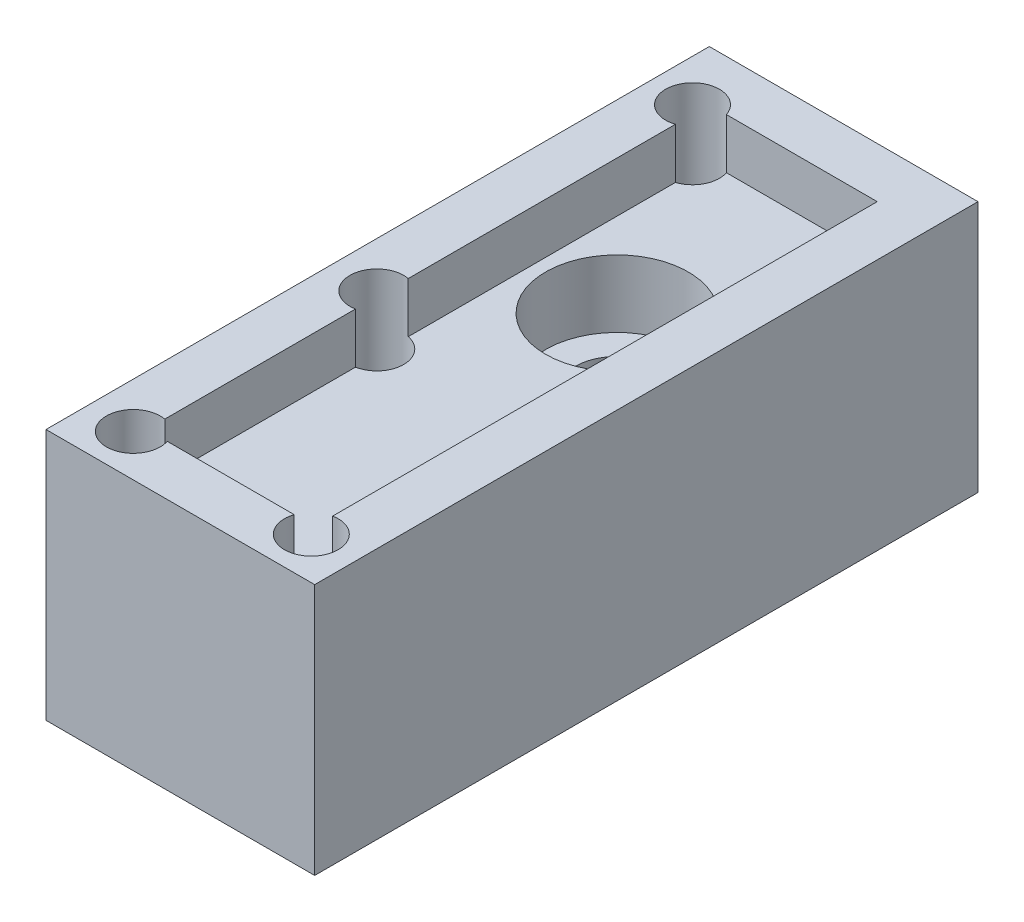
ISO-10303-21;
HEADER;
FILE_DESCRIPTION(('STEP AP214'),'2;1');
FILE_NAME('part.step','',(''),(''),'','','');
FILE_SCHEMA(('AUTOMOTIVE_DESIGN { 1 0 10303 214 1 1 1 1 }'));
ENDSEC;
DATA;
#1=APPLICATION_CONTEXT('core data for automotive mechanical design processes');
#2=APPLICATION_PROTOCOL_DEFINITION('international standard','automotive_design',2000,#1);
#3=PRODUCT_CONTEXT('',#1,'mechanical');
#4=PRODUCT('Part','Part','',(#3));
#5=PRODUCT_RELATED_PRODUCT_CATEGORY('part','',(#4));
#6=PRODUCT_DEFINITION_FORMATION('','',#4);
#7=PRODUCT_DEFINITION_CONTEXT('part definition',#1,'design');
#8=PRODUCT_DEFINITION('design','',#6,#7);
#9=PRODUCT_DEFINITION_SHAPE('','',#8);
#10=(LENGTH_UNIT() NAMED_UNIT(*) SI_UNIT(.MILLI.,.METRE.));
#11=(NAMED_UNIT(*) PLANE_ANGLE_UNIT() SI_UNIT($,.RADIAN.));
#12=(NAMED_UNIT(*) SI_UNIT($,.STERADIAN.) SOLID_ANGLE_UNIT());
#13=UNCERTAINTY_MEASURE_WITH_UNIT(LENGTH_MEASURE(1.E-05),#10,'distance_accuracy_value','');
#14=(GEOMETRIC_REPRESENTATION_CONTEXT(3) GLOBAL_UNCERTAINTY_ASSIGNED_CONTEXT((#13)) GLOBAL_UNIT_ASSIGNED_CONTEXT((#10,
#11,#12)) REPRESENTATION_CONTEXT('',''));
#15=CARTESIAN_POINT('',(0.,0.,0.));
#16=DIRECTION('',(0.,0.,1.));
#17=DIRECTION('',(1.,0.,0.));
#18=AXIS2_PLACEMENT_3D('',#15,#16,#17);
#19=CARTESIAN_POINT('',(8.,-8.,-26.));
#20=DIRECTION('',(0.,1.,0.));
#21=DIRECTION('',(0.,0.,1.));
#22=AXIS2_PLACEMENT_3D('',#19,#20,#21);
#23=CYLINDRICAL_SURFACE('',#22,2.5);
#24=CARTESIAN_POINT('',(8.,0.,-26.));
#25=DIRECTION('',(0.,-1.,0.));
#26=DIRECTION('',(0.,0.,-1.));
#27=AXIS2_PLACEMENT_3D('',#24,#25,#26);
#28=CIRCLE('',#27,2.5);
#29=CARTESIAN_POINT('',(8.,0.,-28.5));
#30=VERTEX_POINT('',#29);
#31=EDGE_CURVE('E242',#30,#30,#28,.T.);
#32=ORIENTED_EDGE('',*,*,#31,.T.);
#33=EDGE_LOOP('',(#32));
#34=FACE_BOUND('',#33,.T.);
#35=CARTESIAN_POINT('',(8.,8.,-26.));
#36=DIRECTION('',(0.,1.,0.));
#37=DIRECTION('',(0.,0.,1.));
#38=AXIS2_PLACEMENT_3D('',#35,#36,#37);
#39=CIRCLE('',#38,2.5);
#40=CARTESIAN_POINT('',(8.,8.,-23.5));
#41=VERTEX_POINT('',#40);
#42=EDGE_CURVE('E36',#41,#41,#39,.F.);
#43=ORIENTED_EDGE('',*,*,#42,.F.);
#44=EDGE_LOOP('',(#43));
#45=FACE_BOUND('',#44,.T.);
#46=ADVANCED_FACE('F32',(#34,#45),#23,.F.);
#47=CARTESIAN_POINT('',(3.,12.,-3.));
#48=DIRECTION('',(-1.,0.,0.));
#49=DIRECTION('',(0.,0.,1.));
#50=AXIS2_PLACEMENT_3D('',#47,#48,#49);
#51=PLANE('',#50);
#52=DIRECTION('',(0.,-1.,0.));
#53=VECTOR('',#52,1.);
#54=CARTESIAN_POINT('',(3.,18.,-18.5716233645502));
#55=LINE('',#54,#53);
#56=CARTESIAN_POINT('',(3.,12.,-18.5716233645502));
#57=VERTEX_POINT('',#56);
#58=CARTESIAN_POINT('',(3.,15.,-18.5716233645502));
#59=VERTEX_POINT('',#58);
#60=EDGE_CURVE('E205',#57,#59,#55,.F.);
#61=ORIENTED_EDGE('',*,*,#60,.F.);
#62=DIRECTION('',(0.,0.,1.));
#63=VECTOR('',#62,1.);
#64=CARTESIAN_POINT('',(3.,12.,-3.));
#65=LINE('',#64,#63);
#66=CARTESIAN_POINT('',(3.,12.,-34.4801315846429));
#67=VERTEX_POINT('',#66);
#68=EDGE_CURVE('E211',#67,#57,#65,.T.);
#69=ORIENTED_EDGE('',*,*,#68,.F.);
#70=DIRECTION('',(0.,-1.,0.));
#71=VECTOR('',#70,1.);
#72=CARTESIAN_POINT('',(3.,18.,-34.4801315846429));
#73=LINE('',#72,#71);
#74=CARTESIAN_POINT('',(3.,15.,-34.4801315846429));
#75=VERTEX_POINT('',#74);
#76=EDGE_CURVE('E132',#75,#67,#73,.T.);
#77=ORIENTED_EDGE('',*,*,#76,.F.);
#78=DIRECTION('',(0.,0.,1.));
#79=VECTOR('',#78,1.);
#80=CARTESIAN_POINT('',(3.,15.,-3.));
#81=LINE('',#80,#79);
#82=EDGE_CURVE('E163',#75,#59,#81,.T.);
#83=ORIENTED_EDGE('',*,*,#82,.T.);
#84=EDGE_LOOP('',(#61,#69,#77,#83));
#85=FACE_BOUND('',#84,.T.);
#86=ADVANCED_FACE('F210',(#85),#51,.F.);
#87=DIRECTION('',(0.,-1.,0.));
#88=VECTOR('',#87,1.);
#89=CARTESIAN_POINT('',(3.,18.,-15.4283766354498));
#90=LINE('',#89,#88);
#91=CARTESIAN_POINT('',(3.,15.,-15.4283766354498));
#92=VERTEX_POINT('',#91);
#93=CARTESIAN_POINT('',(3.,12.,-15.4283766354498));
#94=VERTEX_POINT('',#93);
#95=EDGE_CURVE('E55',#92,#94,#90,.T.);
#96=ORIENTED_EDGE('',*,*,#95,.F.);
#97=CARTESIAN_POINT('',(3.,15.,-4.07162336455017));
#98=VERTEX_POINT('',#97);
#99=EDGE_CURVE('E161',#92,#98,#81,.T.);
#100=ORIENTED_EDGE('',*,*,#99,.T.);
#101=DIRECTION('',(0.,1.,0.));
#102=VECTOR('',#101,1.);
#103=CARTESIAN_POINT('',(3.,0.,-4.07162336455017));
#104=LINE('',#103,#102);
#105=CARTESIAN_POINT('',(3.,12.,-4.07162336455017));
#106=VERTEX_POINT('',#105);
#107=EDGE_CURVE('E164',#98,#106,#104,.F.);
#108=ORIENTED_EDGE('',*,*,#107,.T.);
#109=EDGE_CURVE('E170',#94,#106,#65,.T.);
#110=ORIENTED_EDGE('',*,*,#109,.F.);
#111=EDGE_LOOP('',(#96,#100,#108,#110));
#112=FACE_BOUND('',#111,.T.);
#113=ADVANCED_FACE('F267',(#112),#51,.F.);
#114=CARTESIAN_POINT('',(3.,12.,-36.5));
#115=DIRECTION('',(0.,0.,-1.));
#116=DIRECTION('',(-1.,0.,0.));
#117=AXIS2_PLACEMENT_3D('',#114,#115,#116);
#118=PLANE('',#117);
#119=DIRECTION('',(0.,-1.,0.));
#120=VECTOR('',#119,1.);
#121=CARTESIAN_POINT('',(4.01986841535706,18.,-36.5));
#122=LINE('',#121,#120);
#123=CARTESIAN_POINT('',(4.01986841535706,12.,-36.5));
#124=VERTEX_POINT('',#123);
#125=CARTESIAN_POINT('',(4.01986841535706,15.,-36.5));
#126=VERTEX_POINT('',#125);
#127=EDGE_CURVE('E129',#124,#126,#122,.F.);
#128=ORIENTED_EDGE('',*,*,#127,.F.);
#129=DIRECTION('',(-1.,0.,0.));
#130=VECTOR('',#129,1.);
#131=CARTESIAN_POINT('',(3.,12.,-36.5));
#132=LINE('',#131,#130);
#133=CARTESIAN_POINT('',(13.,12.,-36.5));
#134=VERTEX_POINT('',#133);
#135=EDGE_CURVE('E144',#134,#124,#132,.T.);
#136=ORIENTED_EDGE('',*,*,#135,.F.);
#137=DIRECTION('',(0.,1.,0.));
#138=VECTOR('',#137,1.);
#139=CARTESIAN_POINT('',(13.,12.,-36.5));
#140=LINE('',#139,#138);
#141=CARTESIAN_POINT('',(13.,15.,-36.5));
#142=VERTEX_POINT('',#141);
#143=EDGE_CURVE('E153',#134,#142,#140,.T.);
#144=ORIENTED_EDGE('',*,*,#143,.T.);
#145=DIRECTION('',(-1.,0.,0.));
#146=VECTOR('',#145,1.);
#147=CARTESIAN_POINT('',(3.,15.,-36.5));
#148=LINE('',#147,#146);
#149=EDGE_CURVE('E146',#142,#126,#148,.T.);
#150=ORIENTED_EDGE('',*,*,#149,.T.);
#151=EDGE_LOOP('',(#128,#136,#144,#150));
#152=FACE_BOUND('',#151,.T.);
#153=ADVANCED_FACE('F142',(#152),#118,.F.);
#154=CARTESIAN_POINT('',(13.,12.,-3.));
#155=DIRECTION('',(1.,0.,0.));
#156=DIRECTION('',(0.,0.,-1.));
#157=AXIS2_PLACEMENT_3D('',#154,#155,#156);
#158=PLANE('',#157);
#159=DIRECTION('',(0.,-1.,0.));
#160=VECTOR('',#159,1.);
#161=CARTESIAN_POINT('',(13.,18.,-4.07162336455017));
#162=LINE('',#161,#160);
#163=CARTESIAN_POINT('',(13.,15.,-4.07162336455017));
#164=VERTEX_POINT('',#163);
#165=CARTESIAN_POINT('',(13.,12.,-4.07162336455017));
#166=VERTEX_POINT('',#165);
#167=EDGE_CURVE('E47',#164,#166,#162,.T.);
#168=ORIENTED_EDGE('',*,*,#167,.F.);
#169=DIRECTION('',(0.,0.,-1.));
#170=VECTOR('',#169,1.);
#171=CARTESIAN_POINT('',(13.,15.,-3.));
#172=LINE('',#171,#170);
#173=EDGE_CURVE('E168',#164,#142,#172,.T.);
#174=ORIENTED_EDGE('',*,*,#173,.T.);
#175=ORIENTED_EDGE('',*,*,#143,.F.);
#176=DIRECTION('',(0.,0.,-1.));
#177=VECTOR('',#176,1.);
#178=CARTESIAN_POINT('',(13.,12.,-3.));
#179=LINE('',#178,#177);
#180=EDGE_CURVE('E151',#166,#134,#179,.T.);
#181=ORIENTED_EDGE('',*,*,#180,.F.);
#182=EDGE_LOOP('',(#168,#174,#175,#181));
#183=FACE_BOUND('',#182,.T.);
#184=ADVANCED_FACE('F293',(#183),#158,.F.);
#185=CARTESIAN_POINT('',(3.,12.,-3.));
#186=DIRECTION('',(0.,0.,1.));
#187=DIRECTION('',(1.,0.,0.));
#188=AXIS2_PLACEMENT_3D('',#185,#186,#187);
#189=PLANE('',#188);
#190=DIRECTION('',(0.,-1.,0.));
#191=VECTOR('',#190,1.);
#192=CARTESIAN_POINT('',(11.7801315846429,18.,-3.));
#193=LINE('',#192,#191);
#194=CARTESIAN_POINT('',(11.7801315846429,12.,-3.));
#195=VERTEX_POINT('',#194);
#196=CARTESIAN_POINT('',(11.7801315846429,15.,-3.));
#197=VERTEX_POINT('',#196);
#198=EDGE_CURVE('E231',#195,#197,#193,.F.);
#199=ORIENTED_EDGE('',*,*,#198,.F.);
#200=DIRECTION('',(1.,0.,0.));
#201=VECTOR('',#200,1.);
#202=CARTESIAN_POINT('',(3.,12.,-3.));
#203=LINE('',#202,#201);
#204=CARTESIAN_POINT('',(4.21986841535707,12.,-3.));
#205=VERTEX_POINT('',#204);
#206=EDGE_CURVE('E157',#205,#195,#203,.T.);
#207=ORIENTED_EDGE('',*,*,#206,.F.);
#208=DIRECTION('',(0.,1.,0.));
#209=VECTOR('',#208,1.);
#210=CARTESIAN_POINT('',(4.21986841535707,0.,-3.));
#211=LINE('',#210,#209);
#212=CARTESIAN_POINT('',(4.21986841535707,15.,-3.));
#213=VERTEX_POINT('',#212);
#214=EDGE_CURVE('E220',#205,#213,#211,.T.);
#215=ORIENTED_EDGE('',*,*,#214,.T.);
#216=DIRECTION('',(1.,0.,0.));
#217=VECTOR('',#216,1.);
#218=CARTESIAN_POINT('',(3.,15.,-3.));
#219=LINE('',#218,#217);
#220=EDGE_CURVE('E165',#213,#197,#219,.T.);
#221=ORIENTED_EDGE('',*,*,#220,.T.);
#222=EDGE_LOOP('',(#199,#207,#215,#221));
#223=FACE_BOUND('',#222,.T.);
#224=ADVANCED_FACE('F296',(#223),#189,.F.);
#225=CARTESIAN_POINT('',(0.,15.,0.));
#226=DIRECTION('',(1.,0.,0.));
#227=DIRECTION('',(0.,0.,-1.));
#228=AXIS2_PLACEMENT_3D('',#225,#226,#227);
#229=PLANE('',#228);
#230=DIRECTION('',(0.,0.,1.));
#231=VECTOR('',#230,1.);
#232=CARTESIAN_POINT('',(0.,0.,0.));
#233=LINE('',#232,#231);
#234=CARTESIAN_POINT('',(0.,0.,-39.5));
#235=VERTEX_POINT('',#234);
#236=CARTESIAN_POINT('',(0.,0.,0.));
#237=VERTEX_POINT('',#236);
#238=EDGE_CURVE('E155',#235,#237,#233,.T.);
#239=ORIENTED_EDGE('',*,*,#238,.T.);
#240=DIRECTION('',(0.,-1.,0.));
#241=VECTOR('',#240,1.);
#242=CARTESIAN_POINT('',(0.,15.,0.));
#243=LINE('',#242,#241);
#244=CARTESIAN_POINT('',(0.,15.,0.));
#245=VERTEX_POINT('',#244);
#246=EDGE_CURVE('E198',#245,#237,#243,.T.);
#247=ORIENTED_EDGE('',*,*,#246,.F.);
#248=DIRECTION('',(0.,0.,1.));
#249=VECTOR('',#248,1.);
#250=CARTESIAN_POINT('',(0.,15.,0.));
#251=LINE('',#250,#249);
#252=CARTESIAN_POINT('',(0.,15.,-39.5));
#253=VERTEX_POINT('',#252);
#254=EDGE_CURVE('E172',#253,#245,#251,.T.);
#255=ORIENTED_EDGE('',*,*,#254,.F.);
#256=DIRECTION('',(0.,-1.,0.));
#257=VECTOR('',#256,1.);
#258=CARTESIAN_POINT('',(0.,15.,-39.5));
#259=LINE('',#258,#257);
#260=EDGE_CURVE('E182',#253,#235,#259,.T.);
#261=ORIENTED_EDGE('',*,*,#260,.T.);
#262=EDGE_LOOP('',(#239,#247,#255,#261));
#263=FACE_BOUND('',#262,.T.);
#264=ADVANCED_FACE('F34',(#263),#229,.F.);
#265=CARTESIAN_POINT('',(0.,15.,0.));
#266=DIRECTION('',(0.,0.,-1.));
#267=DIRECTION('',(-1.,0.,0.));
#268=AXIS2_PLACEMENT_3D('',#265,#266,#267);
#269=PLANE('',#268);
#270=DIRECTION('',(1.,0.,0.));
#271=VECTOR('',#270,1.);
#272=CARTESIAN_POINT('',(0.,0.,0.));
#273=LINE('',#272,#271);
#274=CARTESIAN_POINT('',(16.,0.,0.));
#275=VERTEX_POINT('',#274);
#276=EDGE_CURVE('E185',#237,#275,#273,.T.);
#277=ORIENTED_EDGE('',*,*,#276,.T.);
#278=DIRECTION('',(0.,-1.,0.));
#279=VECTOR('',#278,1.);
#280=CARTESIAN_POINT('',(16.,15.,0.));
#281=LINE('',#280,#279);
#282=CARTESIAN_POINT('',(16.,15.,0.));
#283=VERTEX_POINT('',#282);
#284=EDGE_CURVE('E195',#283,#275,#281,.T.);
#285=ORIENTED_EDGE('',*,*,#284,.F.);
#286=DIRECTION('',(1.,0.,0.));
#287=VECTOR('',#286,1.);
#288=CARTESIAN_POINT('',(0.,15.,0.));
#289=LINE('',#288,#287);
#290=EDGE_CURVE('E175',#245,#283,#289,.T.);
#291=ORIENTED_EDGE('',*,*,#290,.F.);
#292=ORIENTED_EDGE('',*,*,#246,.T.);
#293=EDGE_LOOP('',(#277,#285,#291,#292));
#294=FACE_BOUND('',#293,.T.);
#295=ADVANCED_FACE('F314',(#294),#269,.F.);
#296=CARTESIAN_POINT('',(16.,15.,0.));
#297=DIRECTION('',(-1.,0.,0.));
#298=DIRECTION('',(0.,0.,1.));
#299=AXIS2_PLACEMENT_3D('',#296,#297,#298);
#300=PLANE('',#299);
#301=DIRECTION('',(0.,0.,-1.));
#302=VECTOR('',#301,1.);
#303=CARTESIAN_POINT('',(16.,0.,0.));
#304=LINE('',#303,#302);
#305=CARTESIAN_POINT('',(16.,0.,-39.5));
#306=VERTEX_POINT('',#305);
#307=EDGE_CURVE('E187',#275,#306,#304,.T.);
#308=ORIENTED_EDGE('',*,*,#307,.T.);
#309=DIRECTION('',(0.,-1.,0.));
#310=VECTOR('',#309,1.);
#311=CARTESIAN_POINT('',(16.,15.,-39.5));
#312=LINE('',#311,#310);
#313=CARTESIAN_POINT('',(16.,15.,-39.5));
#314=VERTEX_POINT('',#313);
#315=EDGE_CURVE('E192',#314,#306,#312,.T.);
#316=ORIENTED_EDGE('',*,*,#315,.F.);
#317=DIRECTION('',(0.,0.,-1.));
#318=VECTOR('',#317,1.);
#319=CARTESIAN_POINT('',(16.,15.,0.));
#320=LINE('',#319,#318);
#321=EDGE_CURVE('E178',#283,#314,#320,.T.);
#322=ORIENTED_EDGE('',*,*,#321,.F.);
#323=ORIENTED_EDGE('',*,*,#284,.T.);
#324=EDGE_LOOP('',(#308,#316,#322,#323));
#325=FACE_BOUND('',#324,.T.);
#326=ADVANCED_FACE('F311',(#325),#300,.F.);
#327=CARTESIAN_POINT('',(0.,15.,-39.5));
#328=DIRECTION('',(0.,0.,1.));
#329=DIRECTION('',(1.,0.,0.));
#330=AXIS2_PLACEMENT_3D('',#327,#328,#329);
#331=PLANE('',#330);
#332=DIRECTION('',(-1.,0.,0.));
#333=VECTOR('',#332,1.);
#334=CARTESIAN_POINT('',(0.,0.,-39.5));
#335=LINE('',#334,#333);
#336=EDGE_CURVE('E176',#306,#235,#335,.T.);
#337=ORIENTED_EDGE('',*,*,#336,.T.);
#338=ORIENTED_EDGE('',*,*,#260,.F.);
#339=DIRECTION('',(-1.,0.,0.));
#340=VECTOR('',#339,1.);
#341=CARTESIAN_POINT('',(0.,15.,-39.5));
#342=LINE('',#341,#340);
#343=EDGE_CURVE('E180',#314,#253,#342,.T.);
#344=ORIENTED_EDGE('',*,*,#343,.F.);
#345=ORIENTED_EDGE('',*,*,#315,.T.);
#346=EDGE_LOOP('',(#337,#338,#344,#345));
#347=FACE_BOUND('',#346,.T.);
#348=ADVANCED_FACE('F304',(#347),#331,.F.);
#349=CARTESIAN_POINT('',(0.,15.,0.));
#350=DIRECTION('',(0.,-1.,0.));
#351=DIRECTION('',(0.,0.,-1.));
#352=AXIS2_PLACEMENT_3D('',#349,#350,#351);
#353=PLANE('',#352);
#354=CARTESIAN_POINT('',(13.3,15.,-2.5));
#355=DIRECTION('',(0.,-1.,0.));
#356=DIRECTION('',(0.,0.,-1.));
#357=AXIS2_PLACEMENT_3D('',#354,#355,#356);
#358=CIRCLE('',#357,1.6);
#359=EDGE_CURVE('E228',#197,#164,#358,.F.);
#360=ORIENTED_EDGE('',*,*,#359,.F.);
#361=ORIENTED_EDGE('',*,*,#220,.F.);
#362=CARTESIAN_POINT('',(2.7,15.,-2.5));
#363=DIRECTION('',(0.,1.,0.));
#364=DIRECTION('',(0.,0.,1.));
#365=AXIS2_PLACEMENT_3D('',#362,#363,#364);
#366=CIRCLE('',#365,1.6);
#367=EDGE_CURVE('E226',#98,#213,#366,.T.);
#368=ORIENTED_EDGE('',*,*,#367,.F.);
#369=ORIENTED_EDGE('',*,*,#99,.F.);
#370=CARTESIAN_POINT('',(2.7,15.,-17.));
#371=DIRECTION('',(0.,-1.,0.));
#372=DIRECTION('',(0.,0.,-1.));
#373=AXIS2_PLACEMENT_3D('',#370,#371,#372);
#374=CIRCLE('',#373,1.6);
#375=EDGE_CURVE('E213',#59,#92,#374,.F.);
#376=ORIENTED_EDGE('',*,*,#375,.F.);
#377=ORIENTED_EDGE('',*,*,#82,.F.);
#378=CARTESIAN_POINT('',(2.5,15.,-36.));
#379=DIRECTION('',(0.,-1.,0.));
#380=DIRECTION('',(0.,0.,-1.));
#381=AXIS2_PLACEMENT_3D('',#378,#379,#380);
#382=CIRCLE('',#381,1.6);
#383=EDGE_CURVE('E235',#126,#75,#382,.F.);
#384=ORIENTED_EDGE('',*,*,#383,.F.);
#385=ORIENTED_EDGE('',*,*,#149,.F.);
#386=ORIENTED_EDGE('',*,*,#173,.F.);
#387=EDGE_LOOP('',(#360,#361,#368,#369,#376,#377,#384,#385,#386));
#388=FACE_BOUND('',#387,.T.);
#389=ORIENTED_EDGE('',*,*,#254,.T.);
#390=ORIENTED_EDGE('',*,*,#290,.T.);
#391=ORIENTED_EDGE('',*,*,#321,.T.);
#392=ORIENTED_EDGE('',*,*,#343,.T.);
#393=EDGE_LOOP('',(#389,#390,#391,#392));
#394=FACE_BOUND('',#393,.T.);
#395=ADVANCED_FACE('F301',(#388,#394),#353,.F.);
#396=CARTESIAN_POINT('',(0.,0.,0.));
#397=DIRECTION('',(0.,-1.,0.));
#398=DIRECTION('',(0.,0.,-1.));
#399=AXIS2_PLACEMENT_3D('',#396,#397,#398);
#400=PLANE('',#399);
#401=ORIENTED_EDGE('',*,*,#31,.F.);
#402=EDGE_LOOP('',(#401));
#403=FACE_BOUND('',#402,.T.);
#404=CARTESIAN_POINT('',(13.3,0.,-2.5));
#405=DIRECTION('',(0.,1.,0.));
#406=DIRECTION('',(0.,0.,1.));
#407=AXIS2_PLACEMENT_3D('',#404,#405,#406);
#408=CIRCLE('',#407,1.6);
#409=CARTESIAN_POINT('',(13.3,0.,-0.899999999999998));
#410=VERTEX_POINT('',#409);
#411=EDGE_CURVE('E147',#410,#410,#408,.T.);
#412=ORIENTED_EDGE('',*,*,#411,.T.);
#413=EDGE_LOOP('',(#412));
#414=FACE_BOUND('',#413,.T.);
#415=CARTESIAN_POINT('',(2.7,0.,-17.));
#416=DIRECTION('',(0.,1.,0.));
#417=DIRECTION('',(0.,0.,1.));
#418=AXIS2_PLACEMENT_3D('',#415,#416,#417);
#419=CIRCLE('',#418,1.6);
#420=CARTESIAN_POINT('',(2.7,0.,-15.4));
#421=VERTEX_POINT('',#420);
#422=EDGE_CURVE('E241',#421,#421,#419,.T.);
#423=ORIENTED_EDGE('',*,*,#422,.T.);
#424=EDGE_LOOP('',(#423));
#425=FACE_BOUND('',#424,.T.);
#426=CARTESIAN_POINT('',(2.5,0.,-36.));
#427=DIRECTION('',(0.,1.,0.));
#428=DIRECTION('',(0.,0.,1.));
#429=AXIS2_PLACEMENT_3D('',#426,#427,#428);
#430=CIRCLE('',#429,1.6);
#431=CARTESIAN_POINT('',(2.5,0.,-34.4));
#432=VERTEX_POINT('',#431);
#433=EDGE_CURVE('E238',#432,#432,#430,.T.);
#434=ORIENTED_EDGE('',*,*,#433,.T.);
#435=EDGE_LOOP('',(#434));
#436=FACE_BOUND('',#435,.T.);
#437=CARTESIAN_POINT('',(2.7,0.,-2.5));
#438=DIRECTION('',(0.,1.,0.));
#439=DIRECTION('',(0.,0.,1.));
#440=AXIS2_PLACEMENT_3D('',#437,#438,#439);
#441=CIRCLE('',#440,1.6);
#442=CARTESIAN_POINT('',(2.7,0.,-0.9));
#443=VERTEX_POINT('',#442);
#444=EDGE_CURVE('E223',#443,#443,#441,.T.);
#445=ORIENTED_EDGE('',*,*,#444,.T.);
#446=EDGE_LOOP('',(#445));
#447=FACE_BOUND('',#446,.T.);
#448=ORIENTED_EDGE('',*,*,#238,.F.);
#449=ORIENTED_EDGE('',*,*,#336,.F.);
#450=ORIENTED_EDGE('',*,*,#307,.F.);
#451=ORIENTED_EDGE('',*,*,#276,.F.);
#452=EDGE_LOOP('',(#448,#449,#450,#451));
#453=FACE_BOUND('',#452,.T.);
#454=ADVANCED_FACE('F289',(#403,#414,#425,#436,#447,#453),#400,.T.);
#455=CARTESIAN_POINT('',(0.,12.,0.));
#456=DIRECTION('',(0.,-1.,0.));
#457=DIRECTION('',(0.,0.,-1.));
#458=AXIS2_PLACEMENT_3D('',#455,#456,#457);
#459=PLANE('',#458);
#460=CARTESIAN_POINT('',(8.,12.,-26.));
#461=DIRECTION('',(0.,1.,0.));
#462=DIRECTION('',(0.,0.,1.));
#463=AXIS2_PLACEMENT_3D('',#460,#461,#462);
#464=CIRCLE('',#463,4.25);
#465=CARTESIAN_POINT('',(8.,12.,-21.75));
#466=VERTEX_POINT('',#465);
#467=EDGE_CURVE('E249',#466,#466,#464,.T.);
#468=ORIENTED_EDGE('',*,*,#467,.F.);
#469=EDGE_LOOP('',(#468));
#470=FACE_BOUND('',#469,.T.);
#471=CARTESIAN_POINT('',(13.3,12.,-2.5));
#472=DIRECTION('',(0.,-1.,0.));
#473=DIRECTION('',(0.,0.,-1.));
#474=AXIS2_PLACEMENT_3D('',#471,#472,#473);
#475=CIRCLE('',#474,1.6);
#476=EDGE_CURVE('E11',#166,#195,#475,.F.);
#477=ORIENTED_EDGE('',*,*,#476,.F.);
#478=ORIENTED_EDGE('',*,*,#180,.T.);
#479=ORIENTED_EDGE('',*,*,#135,.T.);
#480=CARTESIAN_POINT('',(2.5,12.,-36.));
#481=DIRECTION('',(0.,-1.,0.));
#482=DIRECTION('',(0.,0.,-1.));
#483=AXIS2_PLACEMENT_3D('',#480,#481,#482);
#484=CIRCLE('',#483,1.6);
#485=EDGE_CURVE('E126',#67,#124,#484,.F.);
#486=ORIENTED_EDGE('',*,*,#485,.F.);
#487=ORIENTED_EDGE('',*,*,#68,.T.);
#488=CARTESIAN_POINT('',(2.7,12.,-17.));
#489=DIRECTION('',(0.,-1.,0.));
#490=DIRECTION('',(0.,0.,-1.));
#491=AXIS2_PLACEMENT_3D('',#488,#489,#490);
#492=CIRCLE('',#491,1.6);
#493=EDGE_CURVE('E41',#94,#57,#492,.F.);
#494=ORIENTED_EDGE('',*,*,#493,.F.);
#495=ORIENTED_EDGE('',*,*,#109,.T.);
#496=CARTESIAN_POINT('',(2.7,12.,-2.5));
#497=DIRECTION('',(0.,-1.,0.));
#498=DIRECTION('',(0.,0.,-1.));
#499=AXIS2_PLACEMENT_3D('',#496,#497,#498);
#500=CIRCLE('',#499,1.6);
#501=EDGE_CURVE('E137',#106,#205,#500,.T.);
#502=ORIENTED_EDGE('',*,*,#501,.T.);
#503=ORIENTED_EDGE('',*,*,#206,.T.);
#504=EDGE_LOOP('',(#477,#478,#479,#486,#487,#494,#495,#502,#503));
#505=FACE_BOUND('',#504,.T.);
#506=ADVANCED_FACE('F149',(#470,#505),#459,.F.);
#507=CARTESIAN_POINT('',(2.7,0.,-2.5));
#508=DIRECTION('',(0.,1.,0.));
#509=DIRECTION('',(0.,0.,1.));
#510=AXIS2_PLACEMENT_3D('',#507,#508,#509);
#511=CYLINDRICAL_SURFACE('',#510,1.6);
#512=ORIENTED_EDGE('',*,*,#444,.F.);
#513=EDGE_LOOP('',(#512));
#514=FACE_BOUND('',#513,.T.);
#515=ORIENTED_EDGE('',*,*,#367,.T.);
#516=ORIENTED_EDGE('',*,*,#214,.F.);
#517=ORIENTED_EDGE('',*,*,#501,.F.);
#518=ORIENTED_EDGE('',*,*,#107,.F.);
#519=EDGE_LOOP('',(#515,#516,#517,#518));
#520=FACE_BOUND('',#519,.T.);
#521=ADVANCED_FACE('F282',(#514,#520),#511,.F.);
#522=CARTESIAN_POINT('',(2.5,18.,-36.));
#523=DIRECTION('',(0.,-1.,0.));
#524=DIRECTION('',(0.,0.,-1.));
#525=AXIS2_PLACEMENT_3D('',#522,#523,#524);
#526=CYLINDRICAL_SURFACE('',#525,1.6);
#527=ORIENTED_EDGE('',*,*,#433,.F.);
#528=EDGE_LOOP('',(#527));
#529=FACE_BOUND('',#528,.T.);
#530=ORIENTED_EDGE('',*,*,#383,.T.);
#531=ORIENTED_EDGE('',*,*,#76,.T.);
#532=ORIENTED_EDGE('',*,*,#485,.T.);
#533=ORIENTED_EDGE('',*,*,#127,.T.);
#534=EDGE_LOOP('',(#530,#531,#532,#533));
#535=FACE_BOUND('',#534,.T.);
#536=ADVANCED_FACE('F128',(#529,#535),#526,.F.);
#537=CARTESIAN_POINT('',(2.7,18.,-17.));
#538=DIRECTION('',(0.,-1.,0.));
#539=DIRECTION('',(0.,0.,-1.));
#540=AXIS2_PLACEMENT_3D('',#537,#538,#539);
#541=CYLINDRICAL_SURFACE('',#540,1.6);
#542=ORIENTED_EDGE('',*,*,#422,.F.);
#543=EDGE_LOOP('',(#542));
#544=FACE_BOUND('',#543,.T.);
#545=ORIENTED_EDGE('',*,*,#375,.T.);
#546=ORIENTED_EDGE('',*,*,#95,.T.);
#547=ORIENTED_EDGE('',*,*,#493,.T.);
#548=ORIENTED_EDGE('',*,*,#60,.T.);
#549=EDGE_LOOP('',(#545,#546,#547,#548));
#550=FACE_BOUND('',#549,.T.);
#551=ADVANCED_FACE('F204',(#544,#550),#541,.F.);
#552=CARTESIAN_POINT('',(13.3,18.,-2.5));
#553=DIRECTION('',(0.,-1.,0.));
#554=DIRECTION('',(0.,0.,-1.));
#555=AXIS2_PLACEMENT_3D('',#552,#553,#554);
#556=CYLINDRICAL_SURFACE('',#555,1.6);
#557=ORIENTED_EDGE('',*,*,#411,.F.);
#558=EDGE_LOOP('',(#557));
#559=FACE_BOUND('',#558,.T.);
#560=ORIENTED_EDGE('',*,*,#359,.T.);
#561=ORIENTED_EDGE('',*,*,#167,.T.);
#562=ORIENTED_EDGE('',*,*,#476,.T.);
#563=ORIENTED_EDGE('',*,*,#198,.T.);
#564=EDGE_LOOP('',(#560,#561,#562,#563));
#565=FACE_BOUND('',#564,.T.);
#566=ADVANCED_FACE('F273',(#559,#565),#556,.F.);
#567=CARTESIAN_POINT('',(8.,8.,-26.));
#568=DIRECTION('',(0.,1.,0.));
#569=DIRECTION('',(0.,0.,1.));
#570=AXIS2_PLACEMENT_3D('',#567,#568,#569);
#571=PLANE('',#570);
#572=CARTESIAN_POINT('',(8.,8.,-26.));
#573=DIRECTION('',(0.,1.,0.));
#574=DIRECTION('',(0.,0.,1.));
#575=AXIS2_PLACEMENT_3D('',#572,#573,#574);
#576=CIRCLE('',#575,4.25);
#577=CARTESIAN_POINT('',(8.,8.,-21.75));
#578=VERTEX_POINT('',#577);
#579=EDGE_CURVE('E252',#578,#578,#576,.T.);
#580=ORIENTED_EDGE('',*,*,#579,.T.);
#581=EDGE_LOOP('',(#580));
#582=FACE_BOUND('',#581,.T.);
#583=ORIENTED_EDGE('',*,*,#42,.T.);
#584=EDGE_LOOP('',(#583));
#585=FACE_BOUND('',#584,.T.);
#586=ADVANCED_FACE('F259',(#582,#585),#571,.T.);
#587=CARTESIAN_POINT('',(8.,8.,-26.));
#588=DIRECTION('',(0.,1.,0.));
#589=DIRECTION('',(0.,0.,1.));
#590=AXIS2_PLACEMENT_3D('',#587,#588,#589);
#591=CYLINDRICAL_SURFACE('',#590,4.25);
#592=ORIENTED_EDGE('',*,*,#579,.F.);
#593=EDGE_LOOP('',(#592));
#594=FACE_BOUND('',#593,.T.);
#595=ORIENTED_EDGE('',*,*,#467,.T.);
#596=EDGE_LOOP('',(#595));
#597=FACE_BOUND('',#596,.T.);
#598=ADVANCED_FACE('F271',(#594,#597),#591,.F.);
#599=CLOSED_SHELL('',(#46,#86,#113,#153,#184,#224,#264,#295,#326,#348,#395,#454,#506,#521,#536,
#551,#566,#586,#598));
#600=MANIFOLD_SOLID_BREP('B2',#599);
#601=ADVANCED_BREP_SHAPE_REPRESENTATION('',(#18,#600),#14);
#602=SHAPE_DEFINITION_REPRESENTATION(#9,#601);
ENDSEC;
END-ISO-10303-21;
